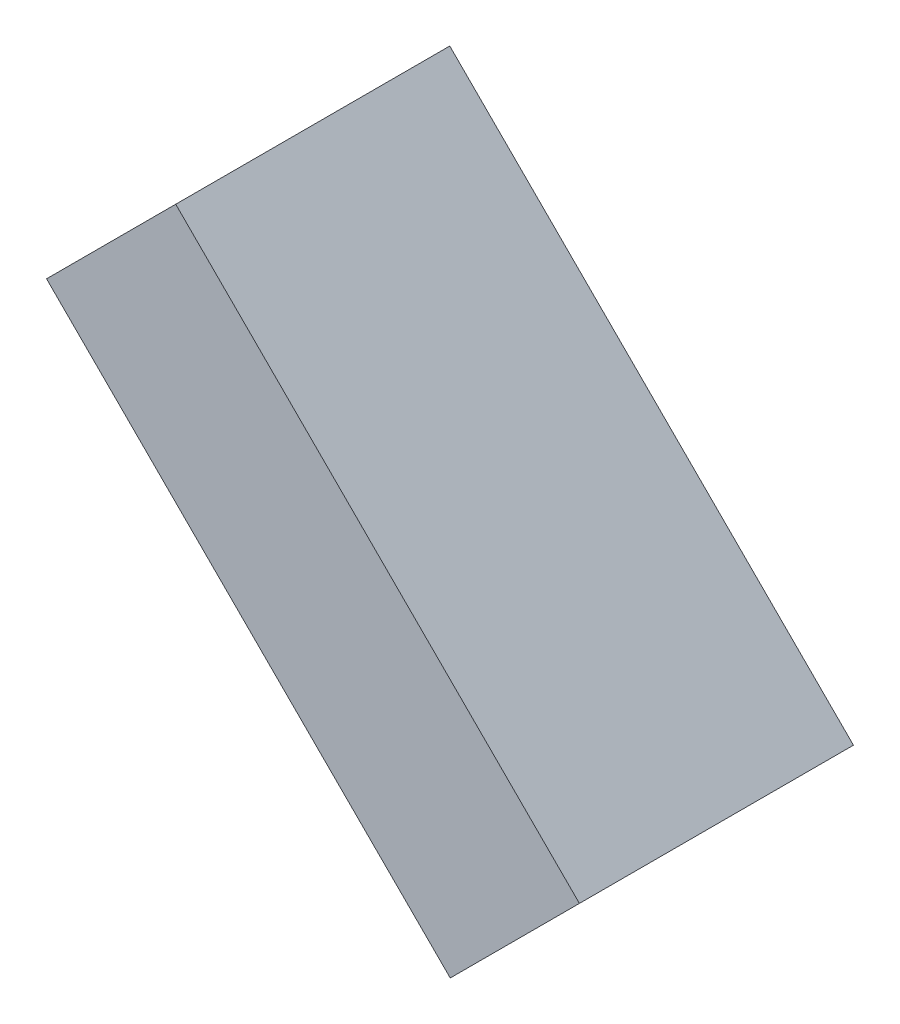
ISO-10303-21;
HEADER;
FILE_DESCRIPTION(('STEP AP214'),'2;1');
FILE_NAME('part.step','',(''),(''),'','','');
FILE_SCHEMA(('AUTOMOTIVE_DESIGN { 1 0 10303 214 1 1 1 1 }'));
ENDSEC;
DATA;
#1=APPLICATION_CONTEXT('core data for automotive mechanical design processes');
#2=APPLICATION_PROTOCOL_DEFINITION('international standard','automotive_design',2000,#1);
#3=PRODUCT_CONTEXT('',#1,'mechanical');
#4=PRODUCT('Part','Part','',(#3));
#5=PRODUCT_RELATED_PRODUCT_CATEGORY('part','',(#4));
#6=PRODUCT_DEFINITION_FORMATION('','',#4);
#7=PRODUCT_DEFINITION_CONTEXT('part definition',#1,'design');
#8=PRODUCT_DEFINITION('design','',#6,#7);
#9=PRODUCT_DEFINITION_SHAPE('','',#8);
#10=(LENGTH_UNIT() NAMED_UNIT(*) SI_UNIT(.MILLI.,.METRE.));
#11=(NAMED_UNIT(*) PLANE_ANGLE_UNIT() SI_UNIT($,.RADIAN.));
#12=(NAMED_UNIT(*) SI_UNIT($,.STERADIAN.) SOLID_ANGLE_UNIT());
#13=UNCERTAINTY_MEASURE_WITH_UNIT(LENGTH_MEASURE(1.E-05),#10,'distance_accuracy_value','');
#14=(GEOMETRIC_REPRESENTATION_CONTEXT(3) GLOBAL_UNCERTAINTY_ASSIGNED_CONTEXT((#13)) GLOBAL_UNIT_ASSIGNED_CONTEXT((#10,
#11,#12)) REPRESENTATION_CONTEXT('',''));
#15=CARTESIAN_POINT('',(0.,0.,0.));
#16=DIRECTION('',(0.,0.,1.));
#17=DIRECTION('',(1.,0.,0.));
#18=AXIS2_PLACEMENT_3D('',#15,#16,#17);
#19=CARTESIAN_POINT('',(-20.5232052349829,-0.925096798890065,0.00300106025193915));
#20=CARTESIAN_POINT('',(-20.5232052338702,-0.925096796855556,-0.0329989397480609));
#21=CARTESIAN_POINT('',(-21.5838654067627,0.135563372889794,0.00300108741072563));
#22=CARTESIAN_POINT('',(-21.58386540565,0.135563374924303,-0.0329989125892744));
#23=(BOUNDED_SURFACE() B_SPLINE_SURFACE(1,1,((#19,#20),(#21,#22)),.UNSPECIFIED.,.F.,.F.,
.F.) B_SPLINE_SURFACE_WITH_KNOTS((2,2),(2,2),(-0.00137500000000005,0.000125000000000005),
(-3.3E-05,3.E-06),.UNSPECIFIED.) GEOMETRIC_REPRESENTATION_ITEM() RATIONAL_B_SPLINE_SURFACE(((1.,
1.),(1.,1.))) REPRESENTATION_ITEM('') SURFACE());
#24=CARTESIAN_POINT('',(-21.4954770590217,0.0471750254109866,1.08514749312585E-06));
#25=CARTESIAN_POINT('',(-21.4954770580944,0.0471750271064109,-0.0299989148525065));
#26=(BOUNDED_CURVE() B_SPLINE_CURVE(1,(#24,#25),.UNSPECIFIED.,.F.,
.F.) B_SPLINE_CURVE_WITH_KNOTS((2,2),(-2.99999999999996E-05,0.),
.UNSPECIFIED.) CURVE() GEOMETRIC_REPRESENTATION_ITEM() RATIONAL_B_SPLINE_CURVE((1.,1.)) REPRESENTATION_ITEM(''));
#27=CARTESIAN_POINT('',(-21.4954770590217,0.0471750254109893,1.08514749313018E-06));
#28=VERTEX_POINT('',#27);
#29=CARTESIAN_POINT('',(-21.4954770580944,0.0471750271064109,-0.0299989148525065));
#30=VERTEX_POINT('',#29);
#31=EDGE_CURVE('E107',#28,#30,#26,.T.);
#32=CARTESIAN_POINT('',(-20.6115935816112,-0.836708449376777,-0.0299989374848287));
#33=CARTESIAN_POINT('',(-21.4954770580944,0.0471750271064147,-0.0299989148525066));
#34=(BOUNDED_CURVE() B_SPLINE_CURVE(1,(#32,#33),.UNSPECIFIED.,.F.,
.F.) B_SPLINE_CURVE_WITH_KNOTS((2,2),(0.,0.00125),
.UNSPECIFIED.) CURVE() GEOMETRIC_REPRESENTATION_ITEM() RATIONAL_B_SPLINE_CURVE((1.,1.)) REPRESENTATION_ITEM(''));
#35=CARTESIAN_POINT('',(-20.6115935816112,-0.836708449376777,-0.0299989374848287));
#36=VERTEX_POINT('',#35);
#37=EDGE_CURVE('E11',#36,#30,#34,.T.);
#38=CARTESIAN_POINT('',(-20.6115935825385,-0.836708451072201,1.06251517132793E-06));
#39=CARTESIAN_POINT('',(-20.6115935816112,-0.836708449376777,-0.0299989374848287));
#40=(BOUNDED_CURVE() B_SPLINE_CURVE(1,(#38,#39),.UNSPECIFIED.,.F.,
.F.) B_SPLINE_CURVE_WITH_KNOTS((2,2),(-3.E-05,0.),
.UNSPECIFIED.) CURVE() GEOMETRIC_REPRESENTATION_ITEM() RATIONAL_B_SPLINE_CURVE((1.,1.)) REPRESENTATION_ITEM(''));
#41=CARTESIAN_POINT('',(-20.6115935825385,-0.836708451072199,1.06251517133227E-06));
#42=VERTEX_POINT('',#41);
#43=EDGE_CURVE('E130',#42,#36,#40,.T.);
#44=CARTESIAN_POINT('',(-20.6115935825385,-0.836708451072199,1.06251517133227E-06));
#45=CARTESIAN_POINT('',(-21.4954770590217,0.0471750254109951,1.08514749340246E-06));
#46=(BOUNDED_CURVE() B_SPLINE_CURVE(1,(#44,#45),.UNSPECIFIED.,.F.,
.F.) B_SPLINE_CURVE_WITH_KNOTS((2,2),(0.,0.00125),
.UNSPECIFIED.) CURVE() GEOMETRIC_REPRESENTATION_ITEM() RATIONAL_B_SPLINE_CURVE((1.,1.)) REPRESENTATION_ITEM(''));
#47=EDGE_CURVE('E93',#42,#28,#46,.T.);
#48=ORIENTED_EDGE('',*,*,#31,.T.);
#49=ORIENTED_EDGE('',*,*,#37,.F.);
#50=ORIENTED_EDGE('',*,*,#43,.F.);
#51=ORIENTED_EDGE('',*,*,#47,.T.);
#52=EDGE_LOOP('',(#48,#49,#50,#51));
#53=FACE_BOUND('',#52,.T.);
#54=ADVANCED_FACE('F17',(#53),#23,.T.);
#55=CARTESIAN_POINT('',(-21.6100283566466,0.10940042385084,-0.0299989148765113));
#56=CARTESIAN_POINT('',(-20.5493681848668,-0.951259747929002,-0.0299989420352978));
#57=CARTESIAN_POINT('',(-21.2960729457998,0.42335583469765,-0.0299988874296691));
#58=CARTESIAN_POINT('',(-20.23541277402,-0.637304337082192,-0.0299989145884556));
#59=(BOUNDED_SURFACE() B_SPLINE_SURFACE(1,1,((#55,#56),(#57,#58)),.UNSPECIFIED.,.F.,.F.,
.F.) B_SPLINE_SURFACE_WITH_KNOTS((2,2),(2,2),(-0.000406999999999974,3.70000000000023E-05),
(-0.00137500000000003,0.000125000000000004),
.UNSPECIFIED.) GEOMETRIC_REPRESENTATION_ITEM() RATIONAL_B_SPLINE_SURFACE(((1.,1.),(1.,1.))) REPRESENTATION_ITEM('') SURFACE());
#60=CARTESIAN_POINT('',(-21.4954770580944,0.0471750271064109,-0.0299989148525065));
#61=CARTESIAN_POINT('',(-21.2338475490554,0.30880453614542,-0.029998891980138));
#62=(BOUNDED_CURVE() B_SPLINE_CURVE(1,(#60,#61),.UNSPECIFIED.,.F.,
.F.) B_SPLINE_CURVE_WITH_KNOTS((2,2),(0.,0.000369999999999982),
.UNSPECIFIED.) CURVE() GEOMETRIC_REPRESENTATION_ITEM() RATIONAL_B_SPLINE_CURVE((1.,1.)) REPRESENTATION_ITEM(''));
#63=CARTESIAN_POINT('',(-21.2338475490554,0.30880453614543,-0.029998891980138));
#64=VERTEX_POINT('',#63);
#65=EDGE_CURVE('E139',#30,#64,#62,.T.);
#66=CARTESIAN_POINT('',(-20.3499640725723,-0.575078940337759,-0.0299989146124603));
#67=CARTESIAN_POINT('',(-21.2338475490554,0.308804536145385,-0.0299988919801382));
#68=(BOUNDED_CURVE() B_SPLINE_CURVE(1,(#66,#67),.UNSPECIFIED.,.F.,
.F.) B_SPLINE_CURVE_WITH_KNOTS((2,2),(0.,0.00124999999999994),
.UNSPECIFIED.) CURVE() GEOMETRIC_REPRESENTATION_ITEM() RATIONAL_B_SPLINE_CURVE((1.,1.)) REPRESENTATION_ITEM(''));
#69=CARTESIAN_POINT('',(-20.3499640725723,-0.575078940337759,-0.0299989146124603));
#70=VERTEX_POINT('',#69);
#71=EDGE_CURVE('E32',#70,#64,#68,.T.);
#72=CARTESIAN_POINT('',(-20.6115935816112,-0.836708449376777,-0.0299989374848287));
#73=CARTESIAN_POINT('',(-20.3499640725722,-0.575078940337817,-0.0299989146124602));
#74=(BOUNDED_CURVE() B_SPLINE_CURVE(1,(#72,#73),.UNSPECIFIED.,.F.,
.F.) B_SPLINE_CURVE_WITH_KNOTS((2,2),(0.,0.000369999999999912),
.UNSPECIFIED.) CURVE() GEOMETRIC_REPRESENTATION_ITEM() RATIONAL_B_SPLINE_CURVE((1.,1.)) REPRESENTATION_ITEM(''));
#75=EDGE_CURVE('E23',#36,#70,#74,.T.);
#76=ORIENTED_EDGE('',*,*,#65,.T.);
#77=ORIENTED_EDGE('',*,*,#71,.F.);
#78=ORIENTED_EDGE('',*,*,#75,.F.);
#79=ORIENTED_EDGE('',*,*,#37,.T.);
#80=EDGE_LOOP('',(#76,#77,#78,#79));
#81=FACE_BOUND('',#80,.T.);
#82=ADVANCED_FACE('F292',(#81),#59,.T.);
#83=CARTESIAN_POINT('',(-20.261575726593,-0.663467291037873,0.0240010831243077));
#84=CARTESIAN_POINT('',(-20.2615757065642,-0.663467254416708,-0.623998916875692));
#85=CARTESIAN_POINT('',(-21.3222358983729,0.397192880741965,0.0240011102830942));
#86=CARTESIAN_POINT('',(-21.3222358783441,0.39719291736313,-0.623998889716906));
#87=(BOUNDED_SURFACE() B_SPLINE_SURFACE(1,1,((#83,#84),(#85,#86)),.UNSPECIFIED.,.F.,.F.,
.F.) B_SPLINE_SURFACE_WITH_KNOTS((2,2),(2,2),(-0.00137499999999998,0.000125000000000045),
(-5.4E-05,0.000594),
.UNSPECIFIED.) GEOMETRIC_REPRESENTATION_ITEM() RATIONAL_B_SPLINE_SURFACE(((1.,1.),(1.,1.))) REPRESENTATION_ITEM('') SURFACE());
#88=CARTESIAN_POINT('',(-21.2338475490554,0.30880453614543,-0.029998891980138));
#89=CARTESIAN_POINT('',(-21.2338475323648,0.308804566663068,-0.569998891980138));
#90=(BOUNDED_CURVE() B_SPLINE_CURVE(1,(#88,#89),.UNSPECIFIED.,.F.,
.F.) B_SPLINE_CURVE_WITH_KNOTS((2,2),(0.,0.00054),
.UNSPECIFIED.) CURVE() GEOMETRIC_REPRESENTATION_ITEM() RATIONAL_B_SPLINE_CURVE((1.,1.)) REPRESENTATION_ITEM(''));
#91=CARTESIAN_POINT('',(-21.2338475323648,0.308804566663073,-0.569998891980138));
#92=VERTEX_POINT('',#91);
#93=EDGE_CURVE('E172',#64,#92,#90,.T.);
#94=CARTESIAN_POINT('',(-20.3499640558816,-0.575078909820115,-0.56999891461246));
#95=CARTESIAN_POINT('',(-21.2338475323648,0.308804566663079,-0.569998891980138));
#96=(BOUNDED_CURVE() B_SPLINE_CURVE(1,(#94,#95),.UNSPECIFIED.,.F.,
.F.) B_SPLINE_CURVE_WITH_KNOTS((2,2),(0.,0.00125),
.UNSPECIFIED.) CURVE() GEOMETRIC_REPRESENTATION_ITEM() RATIONAL_B_SPLINE_CURVE((1.,1.)) REPRESENTATION_ITEM(''));
#97=CARTESIAN_POINT('',(-20.3499640558816,-0.575078909820115,-0.56999891461246));
#98=VERTEX_POINT('',#97);
#99=EDGE_CURVE('E193',#98,#92,#96,.T.);
#100=CARTESIAN_POINT('',(-20.3499640725723,-0.575078940337759,-0.0299989146124603));
#101=CARTESIAN_POINT('',(-20.3499640558817,-0.575078909820121,-0.56999891461246));
#102=(BOUNDED_CURVE() B_SPLINE_CURVE(1,(#100,#101),.UNSPECIFIED.,.F.,
.F.) B_SPLINE_CURVE_WITH_KNOTS((2,2),(0.,0.00054),
.UNSPECIFIED.) CURVE() GEOMETRIC_REPRESENTATION_ITEM() RATIONAL_B_SPLINE_CURVE((1.,1.)) REPRESENTATION_ITEM(''));
#103=EDGE_CURVE('E158',#70,#98,#102,.T.);
#104=ORIENTED_EDGE('',*,*,#93,.T.);
#105=ORIENTED_EDGE('',*,*,#99,.F.);
#106=ORIENTED_EDGE('',*,*,#103,.F.);
#107=ORIENTED_EDGE('',*,*,#71,.T.);
#108=EDGE_LOOP('',(#104,#105,#106,#107));
#109=FACE_BOUND('',#108,.T.);
#110=ADVANCED_FACE('F19',(#109),#87,.T.);
#111=CARTESIAN_POINT('',(-20.2354127573294,-0.637304306564542,-0.569998914588455));
#112=CARTESIAN_POINT('',(-20.5493681681762,-0.951259717411359,-0.569998942035298));
#113=CARTESIAN_POINT('',(-21.2960729291092,0.423355865215304,-0.569998887429669));
#114=CARTESIAN_POINT('',(-21.610028339956,0.109400454368486,-0.569998914876511));
#115=(BOUNDED_SURFACE() B_SPLINE_SURFACE(1,1,((#111,#112),(#113,#114)),.UNSPECIFIED.,.F.,.F.,
.F.) B_SPLINE_SURFACE_WITH_KNOTS((2,2),(2,2),(-0.00137500000000002,0.000125000000000015),
(-3.7E-05,0.000406999999999988),
.UNSPECIFIED.) GEOMETRIC_REPRESENTATION_ITEM() RATIONAL_B_SPLINE_SURFACE(((1.,1.),(1.,1.))) REPRESENTATION_ITEM('') SURFACE());
#116=CARTESIAN_POINT('',(-21.2338475323648,0.308804566663073,-0.569998891980138));
#117=CARTESIAN_POINT('',(-21.4954770414038,0.0471750576240646,-0.569998914852507));
#118=(BOUNDED_CURVE() B_SPLINE_CURVE(1,(#116,#117),.UNSPECIFIED.,.F.,
.F.) B_SPLINE_CURVE_WITH_KNOTS((2,2),(0.,0.000369999999999981),
.UNSPECIFIED.) CURVE() GEOMETRIC_REPRESENTATION_ITEM() RATIONAL_B_SPLINE_CURVE((1.,1.)) REPRESENTATION_ITEM(''));
#119=CARTESIAN_POINT('',(-21.4954770414038,0.0471750576240548,-0.569998914852506));
#120=VERTEX_POINT('',#119);
#121=EDGE_CURVE('E201',#92,#120,#118,.T.);
#122=CARTESIAN_POINT('',(-20.6115935649206,-0.836708418859133,-0.569998937484828));
#123=CARTESIAN_POINT('',(-21.4954770414038,0.0471750576240587,-0.569998914852506));
#124=(BOUNDED_CURVE() B_SPLINE_CURVE(1,(#122,#123),.UNSPECIFIED.,.F.,
.F.) B_SPLINE_CURVE_WITH_KNOTS((2,2),(0.,0.00125),
.UNSPECIFIED.) CURVE() GEOMETRIC_REPRESENTATION_ITEM() RATIONAL_B_SPLINE_CURVE((1.,1.)) REPRESENTATION_ITEM(''));
#125=CARTESIAN_POINT('',(-20.6115935649206,-0.836708418859133,-0.569998937484828));
#126=VERTEX_POINT('',#125);
#127=EDGE_CURVE('E119',#126,#120,#124,.T.);
#128=CARTESIAN_POINT('',(-20.3499640558816,-0.575078909820115,-0.56999891461246));
#129=CARTESIAN_POINT('',(-20.6115935649206,-0.836708418859126,-0.569998937484828));
#130=(BOUNDED_CURVE() B_SPLINE_CURVE(1,(#128,#129),.UNSPECIFIED.,.F.,
.F.) B_SPLINE_CURVE_WITH_KNOTS((2,2),(0.,0.000369999999999984),
.UNSPECIFIED.) CURVE() GEOMETRIC_REPRESENTATION_ITEM() RATIONAL_B_SPLINE_CURVE((1.,1.)) REPRESENTATION_ITEM(''));
#131=EDGE_CURVE('E150',#98,#126,#130,.T.);
#132=ORIENTED_EDGE('',*,*,#121,.T.);
#133=ORIENTED_EDGE('',*,*,#127,.F.);
#134=ORIENTED_EDGE('',*,*,#131,.F.);
#135=ORIENTED_EDGE('',*,*,#99,.T.);
#136=EDGE_LOOP('',(#132,#133,#134,#135));
#137=FACE_BOUND('',#136,.T.);
#138=ADVANCED_FACE('F299',(#137),#115,.T.);
#139=CARTESIAN_POINT('',(-20.523205217365,-0.925096766677003,-0.56699893974806));
#140=CARTESIAN_POINT('',(-20.5232052162523,-0.925096764642493,-0.60299893974806));
#141=CARTESIAN_POINT('',(-21.5838653891448,0.135563405102855,-0.566998912589274));
#142=CARTESIAN_POINT('',(-21.5838653880321,0.135563407137364,-0.602998912589274));
#143=(BOUNDED_SURFACE() B_SPLINE_SURFACE(1,1,((#139,#140),(#141,#142)),.UNSPECIFIED.,.F.,.F.,
.F.) B_SPLINE_SURFACE_WITH_KNOTS((2,2),(2,2),(-0.00137500000000005,0.000125000000000004),
(0.000537,0.000573),
.UNSPECIFIED.) GEOMETRIC_REPRESENTATION_ITEM() RATIONAL_B_SPLINE_SURFACE(((1.,1.),(1.,1.))) REPRESENTATION_ITEM('') SURFACE());
#144=CARTESIAN_POINT('',(-21.4954770414038,0.0471750576240489,-0.569998914852506));
#145=CARTESIAN_POINT('',(-21.4954770404765,0.0471750593194733,-0.599998914852506));
#146=(BOUNDED_CURVE() B_SPLINE_CURVE(1,(#144,#145),.UNSPECIFIED.,.F.,
.F.) B_SPLINE_CURVE_WITH_KNOTS((2,2),(0.00054,0.00057),
.UNSPECIFIED.) CURVE() GEOMETRIC_REPRESENTATION_ITEM() RATIONAL_B_SPLINE_CURVE((1.,1.)) REPRESENTATION_ITEM(''));
#147=CARTESIAN_POINT('',(-21.4954770404765,0.0471750593194764,-0.599998914852506));
#148=VERTEX_POINT('',#147);
#149=EDGE_CURVE('E210',#120,#148,#146,.T.);
#150=CARTESIAN_POINT('',(-20.6115935639933,-0.836708417163712,-0.599998937484828));
#151=CARTESIAN_POINT('',(-21.4954770404765,0.0471750593194821,-0.599998914852506));
#152=(BOUNDED_CURVE() B_SPLINE_CURVE(1,(#150,#151),.UNSPECIFIED.,.F.,
.F.) B_SPLINE_CURVE_WITH_KNOTS((2,2),(0.,0.00125),
.UNSPECIFIED.) CURVE() GEOMETRIC_REPRESENTATION_ITEM() RATIONAL_B_SPLINE_CURVE((1.,1.)) REPRESENTATION_ITEM(''));
#153=CARTESIAN_POINT('',(-20.6115935639933,-0.836708417163712,-0.599998937484828));
#154=VERTEX_POINT('',#153);
#155=EDGE_CURVE('E179',#154,#148,#152,.T.);
#156=CARTESIAN_POINT('',(-20.6115935649206,-0.836708418859137,-0.569998937484828));
#157=CARTESIAN_POINT('',(-20.6115935639933,-0.836708417163712,-0.599998937484828));
#158=(BOUNDED_CURVE() B_SPLINE_CURVE(1,(#156,#157),.UNSPECIFIED.,.F.,
.F.) B_SPLINE_CURVE_WITH_KNOTS((2,2),(0.00057,0.0006),
.UNSPECIFIED.) CURVE() GEOMETRIC_REPRESENTATION_ITEM() RATIONAL_B_SPLINE_CURVE((1.,1.)) REPRESENTATION_ITEM(''));
#159=EDGE_CURVE('E140',#126,#154,#158,.T.);
#160=ORIENTED_EDGE('',*,*,#149,.T.);
#161=ORIENTED_EDGE('',*,*,#155,.F.);
#162=ORIENTED_EDGE('',*,*,#159,.F.);
#163=ORIENTED_EDGE('',*,*,#127,.T.);
#164=EDGE_LOOP('',(#160,#161,#162,#163));
#165=FACE_BOUND('',#164,.T.);
#166=ADVANCED_FACE('F302',(#165),#143,.T.);
#167=CARTESIAN_POINT('',(-21.2727384044028,0.446690390689872,-0.599998885389701));
#168=CARTESIAN_POINT('',(-21.6121496593723,0.107279135720344,-0.599998915061963));
#169=CARTESIAN_POINT('',(-20.2120782326229,-0.613969781089972,-0.599998912548488));
#170=CARTESIAN_POINT('',(-20.5514894875924,-0.953381036059501,-0.59999894222075));
#171=(BOUNDED_SURFACE() B_SPLINE_SURFACE(1,1,((#167,#168),(#169,#170)),.UNSPECIFIED.,.F.,.F.,
.F.) B_SPLINE_SURFACE_WITH_KNOTS((2,2),(2,2),(-0.000125000000000083,0.00137499999999995),
(-4.00000000000591E-05,0.000439999999999921),
.UNSPECIFIED.) GEOMETRIC_REPRESENTATION_ITEM() RATIONAL_B_SPLINE_SURFACE(((1.,1.),(1.,1.))) REPRESENTATION_ITEM('') SURFACE());
#172=CARTESIAN_POINT('',(-21.4954770404765,0.0471750593194836,-0.599998914852506));
#173=CARTESIAN_POINT('',(-21.2126343280019,0.330017771794089,-0.599998890125621));
#174=(BOUNDED_CURVE() B_SPLINE_CURVE(1,(#172,#173),.UNSPECIFIED.,.F.,
.F.) B_SPLINE_CURVE_WITH_KNOTS((2,2),(-0.000399999999999982,0.),
.UNSPECIFIED.) CURVE() GEOMETRIC_REPRESENTATION_ITEM() RATIONAL_B_SPLINE_CURVE((1.,1.)) REPRESENTATION_ITEM(''));
#175=CARTESIAN_POINT('',(-21.2126343280019,0.330017771794089,-0.599998890125621));
#176=VERTEX_POINT('',#175);
#177=EDGE_CURVE('E102',#148,#176,#174,.T.);
#178=CARTESIAN_POINT('',(-20.3287508515188,-0.553865704689099,-0.599998912757944));
#179=CARTESIAN_POINT('',(-21.2126343280019,0.330017771794046,-0.599998890125622));
#180=(BOUNDED_CURVE() B_SPLINE_CURVE(1,(#178,#179),.UNSPECIFIED.,.F.,
.F.) B_SPLINE_CURVE_WITH_KNOTS((2,2),(0.,0.00124999999999995),
.UNSPECIFIED.) CURVE() GEOMETRIC_REPRESENTATION_ITEM() RATIONAL_B_SPLINE_CURVE((1.,1.)) REPRESENTATION_ITEM(''));
#181=CARTESIAN_POINT('',(-20.3287508515188,-0.553865704689099,-0.599998912757944));
#182=VERTEX_POINT('',#181);
#183=EDGE_CURVE('E92',#182,#176,#180,.T.);
#184=CARTESIAN_POINT('',(-20.6115935639934,-0.836708417163656,-0.599998937484829));
#185=CARTESIAN_POINT('',(-20.3287508515188,-0.553865704689099,-0.599998912757944));
#186=(BOUNDED_CURVE() B_SPLINE_CURVE(1,(#184,#185),.UNSPECIFIED.,.F.,
.F.) B_SPLINE_CURVE_WITH_KNOTS((2,2),(-0.000399999999999913,0.),
.UNSPECIFIED.) CURVE() GEOMETRIC_REPRESENTATION_ITEM() RATIONAL_B_SPLINE_CURVE((1.,1.)) REPRESENTATION_ITEM(''));
#187=EDGE_CURVE('E149',#154,#182,#186,.T.);
#188=ORIENTED_EDGE('',*,*,#177,.T.);
#189=ORIENTED_EDGE('',*,*,#183,.F.);
#190=ORIENTED_EDGE('',*,*,#187,.F.);
#191=ORIENTED_EDGE('',*,*,#155,.T.);
#192=EDGE_LOOP('',(#188,#189,#190,#191));
#193=FACE_BOUND('',#192,.T.);
#194=ADVANCED_FACE('F304',(#193),#171,.T.);
#195=CARTESIAN_POINT('',(-21.3010226960499,0.418406082143078,0.0600011121376107));
#196=CARTESIAN_POINT('',(-21.3010226737957,0.418406122833262,-0.65999888786239));
#197=CARTESIAN_POINT('',(-20.2403625242701,-0.642254089636757,0.0600010849788242));
#198=CARTESIAN_POINT('',(-20.2403625020159,-0.642254048946573,-0.659998915021176));
#199=(BOUNDED_SURFACE() B_SPLINE_SURFACE(1,1,((#195,#196),(#197,#198)),.UNSPECIFIED.,.F.,.F.,
.F.) B_SPLINE_SURFACE_WITH_KNOTS((2,2),(2,2),(-0.000125000000000004,0.00137500000000002),
(-6.E-05,0.00066),.UNSPECIFIED.) GEOMETRIC_REPRESENTATION_ITEM() RATIONAL_B_SPLINE_SURFACE(((1.,
1.),(1.,1.))) REPRESENTATION_ITEM('') SURFACE());
#200=CARTESIAN_POINT('',(-21.2126343280019,0.330017771794089,-0.599998890125621));
#201=CARTESIAN_POINT('',(-21.2126343465471,0.330017737885602,1.10987437816623E-06));
#202=(BOUNDED_CURVE() B_SPLINE_CURVE(1,(#200,#201),.UNSPECIFIED.,.F.,
.F.) B_SPLINE_CURVE_WITH_KNOTS((2,2),(-0.0006,0.),
.UNSPECIFIED.) CURVE() GEOMETRIC_REPRESENTATION_ITEM() RATIONAL_B_SPLINE_CURVE((1.,1.)) REPRESENTATION_ITEM(''));
#203=CARTESIAN_POINT('',(-21.2126343465471,0.330017737885602,1.10987437816623E-06));
#204=VERTEX_POINT('',#203);
#205=EDGE_CURVE('E96',#176,#204,#202,.T.);
#206=CARTESIAN_POINT('',(-20.3287508700639,-0.553865738597587,1.08724205636831E-06));
#207=CARTESIAN_POINT('',(-21.2126343465471,0.330017737885608,1.1098743784385E-06));
#208=(BOUNDED_CURVE() B_SPLINE_CURVE(1,(#206,#207),.UNSPECIFIED.,.F.,
.F.) B_SPLINE_CURVE_WITH_KNOTS((2,2),(0.,0.00125000000000002),
.UNSPECIFIED.) CURVE() GEOMETRIC_REPRESENTATION_ITEM() RATIONAL_B_SPLINE_CURVE((1.,1.)) REPRESENTATION_ITEM(''));
#209=CARTESIAN_POINT('',(-20.3287508700639,-0.553865738597587,1.08724205636831E-06));
#210=VERTEX_POINT('',#209);
#211=EDGE_CURVE('E40',#210,#204,#208,.T.);
#212=CARTESIAN_POINT('',(-20.3287508515187,-0.5538657046891,-0.599998912757944));
#213=CARTESIAN_POINT('',(-20.3287508700639,-0.553865738597587,1.08724205636831E-06));
#214=(BOUNDED_CURVE() B_SPLINE_CURVE(1,(#212,#213),.UNSPECIFIED.,.F.,
.F.) B_SPLINE_CURVE_WITH_KNOTS((2,2),(-0.0006,0.),
.UNSPECIFIED.) CURVE() GEOMETRIC_REPRESENTATION_ITEM() RATIONAL_B_SPLINE_CURVE((1.,1.)) REPRESENTATION_ITEM(''));
#215=EDGE_CURVE('E229',#182,#210,#214,.T.);
#216=ORIENTED_EDGE('',*,*,#205,.T.);
#217=ORIENTED_EDGE('',*,*,#211,.F.);
#218=ORIENTED_EDGE('',*,*,#215,.F.);
#219=ORIENTED_EDGE('',*,*,#183,.T.);
#220=EDGE_LOOP('',(#216,#217,#218,#219));
#221=FACE_BOUND('',#220,.T.);
#222=ADVANCED_FACE('F97',(#221),#199,.T.);
#223=CARTESIAN_POINT('',(-21.272738422948,0.44669035678139,1.11461029900818E-06));
#224=CARTESIAN_POINT('',(-20.2120782511681,-0.61396981499845,1.08745151252395E-06));
#225=CARTESIAN_POINT('',(-21.6121496779175,0.107279101811851,1.08493803711868E-06));
#226=CARTESIAN_POINT('',(-20.5514895061376,-0.953381069967989,1.05777925063446E-06));
#227=(BOUNDED_SURFACE() B_SPLINE_SURFACE(1,1,((#223,#224),(#225,#226)),.UNSPECIFIED.,.F.,.F.,
.F.) B_SPLINE_SURFACE_WITH_KNOTS((2,2),(2,2),(-4.000000000001E-05,0.000439999999999986),
(-0.00137500000000002,0.000125000000000004),
.UNSPECIFIED.) GEOMETRIC_REPRESENTATION_ITEM() RATIONAL_B_SPLINE_SURFACE(((1.,1.),(1.,1.))) REPRESENTATION_ITEM('') SURFACE());
#228=CARTESIAN_POINT('',(-21.2126343465471,0.330017737885597,1.10987437803809E-06));
#229=CARTESIAN_POINT('',(-21.4954770590217,0.0471750254109893,1.08514749313018E-06));
#230=(BOUNDED_CURVE() B_SPLINE_CURVE(1,(#228,#229),.UNSPECIFIED.,.F.,
.F.) B_SPLINE_CURVE_WITH_KNOTS((2,2),(-0.000399999999999985,0.),
.UNSPECIFIED.) CURVE() GEOMETRIC_REPRESENTATION_ITEM() RATIONAL_B_SPLINE_CURVE((1.,1.)) REPRESENTATION_ITEM(''));
#231=EDGE_CURVE('E86',#204,#28,#230,.T.);
#232=CARTESIAN_POINT('',(-20.3287508700639,-0.553865738597592,1.08724205624018E-06));
#233=CARTESIAN_POINT('',(-20.6115935825385,-0.836708451072199,1.06251517133227E-06));
#234=(BOUNDED_CURVE() B_SPLINE_CURVE(1,(#232,#233),.UNSPECIFIED.,.F.,
.F.) B_SPLINE_CURVE_WITH_KNOTS((2,2),(-0.000399999999999985,0.),
.UNSPECIFIED.) CURVE() GEOMETRIC_REPRESENTATION_ITEM() RATIONAL_B_SPLINE_CURVE((1.,1.)) REPRESENTATION_ITEM(''));
#235=EDGE_CURVE('E89',#210,#42,#234,.T.);
#236=ORIENTED_EDGE('',*,*,#231,.T.);
#237=ORIENTED_EDGE('',*,*,#47,.F.);
#238=ORIENTED_EDGE('',*,*,#235,.F.);
#239=ORIENTED_EDGE('',*,*,#211,.T.);
#240=EDGE_LOOP('',(#236,#237,#238,#239));
#241=FACE_BOUND('',#240,.T.);
#242=ADVANCED_FACE('F83',(#241),#227,.T.);
#243=CARTESIAN_POINT('',(-20.300466600671,-0.525581470740945,0.0600010897147449));
#244=CARTESIAN_POINT('',(-20.3004665784168,-0.525581430050761,-0.659998910285256));
#245=CARTESIAN_POINT('',(-20.6398778556405,-0.864992725710478,0.0600010600424832));
#246=CARTESIAN_POINT('',(-20.6398778333863,-0.864992685020294,-0.659998939957517));
#247=(BOUNDED_SURFACE() B_SPLINE_SURFACE(1,1,((#243,#244),(#245,#246)),.UNSPECIFIED.,.F.,.F.,
.F.) B_SPLINE_SURFACE_WITH_KNOTS((2,2),(2,2),(0.000560000000000049,0.00104000000000004),
(-6.E-05,0.00066),.UNSPECIFIED.) GEOMETRIC_REPRESENTATION_ITEM() RATIONAL_B_SPLINE_SURFACE(((1.,
1.),(1.,1.))) REPRESENTATION_ITEM('') SURFACE());
#248=ORIENTED_EDGE('',*,*,#43,.T.);
#249=ORIENTED_EDGE('',*,*,#75,.T.);
#250=ORIENTED_EDGE('',*,*,#103,.T.);
#251=ORIENTED_EDGE('',*,*,#131,.T.);
#252=ORIENTED_EDGE('',*,*,#159,.T.);
#253=ORIENTED_EDGE('',*,*,#187,.T.);
#254=ORIENTED_EDGE('',*,*,#215,.T.);
#255=ORIENTED_EDGE('',*,*,#235,.T.);
#256=EDGE_LOOP('',(#248,#249,#250,#251,#252,#253,#254,#255));
#257=FACE_BOUND('',#256,.T.);
#258=ADVANCED_FACE('F289',(#257),#247,.T.);
#259=CARTESIAN_POINT('',(-21.5237613321237,0.0188907507726613,0.0600010826748048));
#260=CARTESIAN_POINT('',(-21.5237613098695,0.0188907914628453,-0.659998917325194));
#261=CARTESIAN_POINT('',(-21.1843500771541,0.358302005742215,0.0600011123470666));
#262=CARTESIAN_POINT('',(-21.1843500548999,0.358302046432399,-0.659998887652933));
#263=(BOUNDED_SURFACE() B_SPLINE_SURFACE(1,1,((#259,#260),(#261,#262)),.UNSPECIFIED.,.F.,.F.,
.F.) B_SPLINE_SURFACE_WITH_KNOTS((2,2),(2,2),(0.000559999999999982,0.00104),(-6.E-05,0.00066),
.UNSPECIFIED.) GEOMETRIC_REPRESENTATION_ITEM() RATIONAL_B_SPLINE_SURFACE(((1.,1.),(1.,1.))) REPRESENTATION_ITEM('') SURFACE());
#264=ORIENTED_EDGE('',*,*,#31,.F.);
#265=ORIENTED_EDGE('',*,*,#231,.F.);
#266=ORIENTED_EDGE('',*,*,#205,.F.);
#267=ORIENTED_EDGE('',*,*,#177,.F.);
#268=ORIENTED_EDGE('',*,*,#149,.F.);
#269=ORIENTED_EDGE('',*,*,#121,.F.);
#270=ORIENTED_EDGE('',*,*,#93,.F.);
#271=ORIENTED_EDGE('',*,*,#65,.F.);
#272=EDGE_LOOP('',(#264,#265,#266,#267,#268,#269,#270,#271));
#273=FACE_BOUND('',#272,.T.);
#274=ADVANCED_FACE('F104',(#273),#263,.T.);
#275=CLOSED_SHELL('',(#54,#82,#110,#138,#166,#194,#222,#242,#258,#274));
#276=MANIFOLD_SOLID_BREP('B1',#275);
#277=ADVANCED_BREP_SHAPE_REPRESENTATION('',(#18,#276),#14);
#278=SHAPE_DEFINITION_REPRESENTATION(#9,#277);
ENDSEC;
END-ISO-10303-21;
